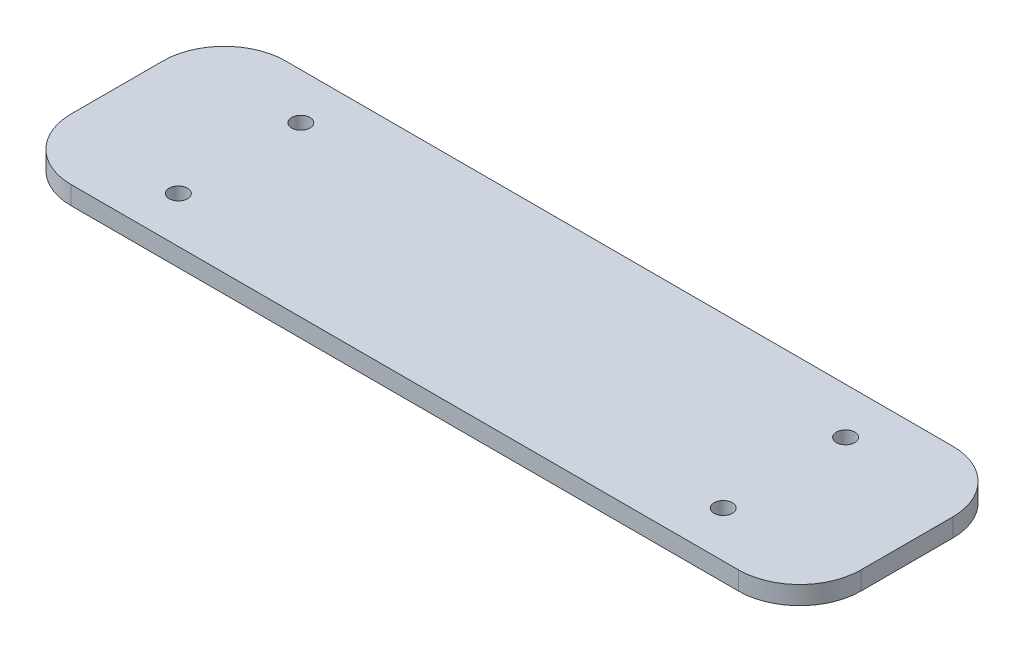
ISO-10303-21;
HEADER;
FILE_DESCRIPTION(('STEP AP214'),'2;1');
FILE_NAME('part.step','',(''),(''),'','','');
FILE_SCHEMA(('AUTOMOTIVE_DESIGN { 1 0 10303 214 1 1 1 1 }'));
ENDSEC;
DATA;
#1=APPLICATION_CONTEXT('core data for automotive mechanical design processes');
#2=APPLICATION_PROTOCOL_DEFINITION('international standard','automotive_design',2000,#1);
#3=PRODUCT_CONTEXT('',#1,'mechanical');
#4=PRODUCT('Part','Part','',(#3));
#5=PRODUCT_RELATED_PRODUCT_CATEGORY('part','',(#4));
#6=PRODUCT_DEFINITION_FORMATION('','',#4);
#7=PRODUCT_DEFINITION_CONTEXT('part definition',#1,'design');
#8=PRODUCT_DEFINITION('design','',#6,#7);
#9=PRODUCT_DEFINITION_SHAPE('','',#8);
#10=(LENGTH_UNIT() NAMED_UNIT(*) SI_UNIT(.MILLI.,.METRE.));
#11=(NAMED_UNIT(*) PLANE_ANGLE_UNIT() SI_UNIT($,.RADIAN.));
#12=(NAMED_UNIT(*) SI_UNIT($,.STERADIAN.) SOLID_ANGLE_UNIT());
#13=UNCERTAINTY_MEASURE_WITH_UNIT(LENGTH_MEASURE(1.E-05),#10,'distance_accuracy_value','');
#14=(GEOMETRIC_REPRESENTATION_CONTEXT(3) GLOBAL_UNCERTAINTY_ASSIGNED_CONTEXT((#13)) GLOBAL_UNIT_ASSIGNED_CONTEXT((#10,
#11,#12)) REPRESENTATION_CONTEXT('',''));
#15=CARTESIAN_POINT('',(0.,0.,0.));
#16=DIRECTION('',(0.,0.,1.));
#17=DIRECTION('',(1.,0.,0.));
#18=AXIS2_PLACEMENT_3D('',#15,#16,#17);
#19=CARTESIAN_POINT('',(0.,3.,0.));
#20=DIRECTION('',(0.,1.,0.));
#21=DIRECTION('',(0.,0.,1.));
#22=AXIS2_PLACEMENT_3D('',#19,#20,#21);
#23=PLANE('',#22);
#24=CARTESIAN_POINT('',(44.5,3.,10.));
#25=DIRECTION('',(0.,1.,0.));
#26=DIRECTION('',(0.,0.,1.));
#27=AXIS2_PLACEMENT_3D('',#24,#25,#26);
#28=CIRCLE('',#27,1.5);
#29=CARTESIAN_POINT('',(44.5,3.,11.5));
#30=VERTEX_POINT('',#29);
#31=EDGE_CURVE('E257',#30,#30,#28,.T.);
#32=ORIENTED_EDGE('',*,*,#31,.F.);
#33=EDGE_LOOP('',(#32));
#34=FACE_BOUND('',#33,.T.);
#35=CARTESIAN_POINT('',(-44.5,3.,-10.));
#36=DIRECTION('',(0.,1.,0.));
#37=DIRECTION('',(0.,0.,1.));
#38=AXIS2_PLACEMENT_3D('',#35,#36,#37);
#39=CIRCLE('',#38,1.5);
#40=CARTESIAN_POINT('',(-44.5,3.,-8.49999999999999));
#41=VERTEX_POINT('',#40);
#42=EDGE_CURVE('E193',#41,#41,#39,.T.);
#43=ORIENTED_EDGE('',*,*,#42,.F.);
#44=EDGE_LOOP('',(#43));
#45=FACE_BOUND('',#44,.T.);
#46=DIRECTION('',(0.,0.,1.));
#47=VECTOR('',#46,1.);
#48=CARTESIAN_POINT('',(-64.5,3.,-17.5));
#49=LINE('',#48,#47);
#50=CARTESIAN_POINT('',(-64.5,3.,-7.5));
#51=VERTEX_POINT('',#50);
#52=CARTESIAN_POINT('',(-64.5,3.,7.5));
#53=VERTEX_POINT('',#52);
#54=EDGE_CURVE('E181',#51,#53,#49,.T.);
#55=ORIENTED_EDGE('',*,*,#54,.T.);
#56=CARTESIAN_POINT('',(-54.5,3.,7.50000000000001));
#57=DIRECTION('',(0.,1.,0.));
#58=DIRECTION('',(0.,0.,1.));
#59=AXIS2_PLACEMENT_3D('',#56,#57,#58);
#60=CIRCLE('',#59,10.);
#61=CARTESIAN_POINT('',(-54.5,3.,17.5));
#62=VERTEX_POINT('',#61);
#63=EDGE_CURVE('E169',#53,#62,#60,.T.);
#64=ORIENTED_EDGE('',*,*,#63,.T.);
#65=DIRECTION('',(1.,0.,0.));
#66=VECTOR('',#65,1.);
#67=CARTESIAN_POINT('',(-64.5,3.,17.5));
#68=LINE('',#67,#66);
#69=CARTESIAN_POINT('',(54.5,3.,17.5));
#70=VERTEX_POINT('',#69);
#71=EDGE_CURVE('E127',#62,#70,#68,.T.);
#72=ORIENTED_EDGE('',*,*,#71,.T.);
#73=CARTESIAN_POINT('',(54.5,3.,7.5));
#74=DIRECTION('',(0.,1.,0.));
#75=DIRECTION('',(0.,0.,1.));
#76=AXIS2_PLACEMENT_3D('',#73,#74,#75);
#77=CIRCLE('',#76,10.);
#78=CARTESIAN_POINT('',(64.5,3.,7.5));
#79=VERTEX_POINT('',#78);
#80=EDGE_CURVE('E166',#70,#79,#77,.T.);
#81=ORIENTED_EDGE('',*,*,#80,.T.);
#82=DIRECTION('',(0.,0.,-1.));
#83=VECTOR('',#82,1.);
#84=CARTESIAN_POINT('',(64.5,3.,-17.5));
#85=LINE('',#84,#83);
#86=CARTESIAN_POINT('',(64.5,3.,-7.5));
#87=VERTEX_POINT('',#86);
#88=EDGE_CURVE('E136',#79,#87,#85,.T.);
#89=ORIENTED_EDGE('',*,*,#88,.T.);
#90=CARTESIAN_POINT('',(54.5,3.,-7.5));
#91=DIRECTION('',(0.,1.,0.));
#92=DIRECTION('',(0.,0.,1.));
#93=AXIS2_PLACEMENT_3D('',#90,#91,#92);
#94=CIRCLE('',#93,10.);
#95=CARTESIAN_POINT('',(54.5,3.,-17.5));
#96=VERTEX_POINT('',#95);
#97=EDGE_CURVE('E61',#87,#96,#94,.T.);
#98=ORIENTED_EDGE('',*,*,#97,.T.);
#99=DIRECTION('',(-1.,0.,0.));
#100=VECTOR('',#99,1.);
#101=CARTESIAN_POINT('',(-64.5,3.,-17.5));
#102=LINE('',#101,#100);
#103=CARTESIAN_POINT('',(-54.5,3.,-17.5));
#104=VERTEX_POINT('',#103);
#105=EDGE_CURVE('E141',#96,#104,#102,.T.);
#106=ORIENTED_EDGE('',*,*,#105,.T.);
#107=CARTESIAN_POINT('',(-54.5,3.,-7.5));
#108=DIRECTION('',(0.,1.,0.));
#109=DIRECTION('',(0.,0.,1.));
#110=AXIS2_PLACEMENT_3D('',#107,#108,#109);
#111=CIRCLE('',#110,10.);
#112=EDGE_CURVE('E161',#104,#51,#111,.T.);
#113=ORIENTED_EDGE('',*,*,#112,.T.);
#114=EDGE_LOOP('',(#55,#64,#72,#81,#89,#98,#106,#113));
#115=FACE_BOUND('',#114,.T.);
#116=CARTESIAN_POINT('',(-44.5,3.,10.));
#117=DIRECTION('',(0.,1.,0.));
#118=DIRECTION('',(0.,0.,1.));
#119=AXIS2_PLACEMENT_3D('',#116,#117,#118);
#120=CIRCLE('',#119,1.5);
#121=CARTESIAN_POINT('',(-44.5,3.,11.5));
#122=VERTEX_POINT('',#121);
#123=EDGE_CURVE('E265',#122,#122,#120,.T.);
#124=ORIENTED_EDGE('',*,*,#123,.F.);
#125=EDGE_LOOP('',(#124));
#126=FACE_BOUND('',#125,.T.);
#127=CARTESIAN_POINT('',(44.5,3.,-10.));
#128=DIRECTION('',(0.,1.,0.));
#129=DIRECTION('',(0.,0.,1.));
#130=AXIS2_PLACEMENT_3D('',#127,#128,#129);
#131=CIRCLE('',#130,1.5);
#132=CARTESIAN_POINT('',(44.5,3.,-8.49999999999999));
#133=VERTEX_POINT('',#132);
#134=EDGE_CURVE('E246',#133,#133,#131,.T.);
#135=ORIENTED_EDGE('',*,*,#134,.F.);
#136=EDGE_LOOP('',(#135));
#137=FACE_BOUND('',#136,.T.);
#138=ADVANCED_FACE('F39',(#34,#45,#115,#126,#137),#23,.T.);
#139=CARTESIAN_POINT('',(0.,0.,0.));
#140=DIRECTION('',(0.,1.,0.));
#141=DIRECTION('',(0.,0.,1.));
#142=AXIS2_PLACEMENT_3D('',#139,#140,#141);
#143=PLANE('',#142);
#144=DIRECTION('',(1.,0.,0.));
#145=VECTOR('',#144,1.);
#146=CARTESIAN_POINT('',(-64.5,0.,17.5));
#147=LINE('',#146,#145);
#148=CARTESIAN_POINT('',(-54.5,0.,17.5));
#149=VERTEX_POINT('',#148);
#150=CARTESIAN_POINT('',(54.5,0.,17.5));
#151=VERTEX_POINT('',#150);
#152=EDGE_CURVE('E124',#149,#151,#147,.T.);
#153=ORIENTED_EDGE('',*,*,#152,.F.);
#154=CARTESIAN_POINT('',(-54.5,0.,7.50000000000001));
#155=DIRECTION('',(0.,1.,0.));
#156=DIRECTION('',(0.,0.,1.));
#157=AXIS2_PLACEMENT_3D('',#154,#155,#156);
#158=CIRCLE('',#157,10.);
#159=CARTESIAN_POINT('',(-64.5,0.,7.5));
#160=VERTEX_POINT('',#159);
#161=EDGE_CURVE('E106',#149,#160,#158,.F.);
#162=ORIENTED_EDGE('',*,*,#161,.T.);
#163=DIRECTION('',(0.,0.,1.));
#164=VECTOR('',#163,1.);
#165=CARTESIAN_POINT('',(-64.5,0.,-17.5));
#166=LINE('',#165,#164);
#167=CARTESIAN_POINT('',(-64.5,0.,-7.5));
#168=VERTEX_POINT('',#167);
#169=EDGE_CURVE('E137',#168,#160,#166,.T.);
#170=ORIENTED_EDGE('',*,*,#169,.F.);
#171=CARTESIAN_POINT('',(-54.5,0.,-7.5));
#172=DIRECTION('',(0.,1.,0.));
#173=DIRECTION('',(0.,0.,1.));
#174=AXIS2_PLACEMENT_3D('',#171,#172,#173);
#175=CIRCLE('',#174,10.);
#176=CARTESIAN_POINT('',(-54.5,0.,-17.5));
#177=VERTEX_POINT('',#176);
#178=EDGE_CURVE('E129',#168,#177,#175,.F.);
#179=ORIENTED_EDGE('',*,*,#178,.T.);
#180=DIRECTION('',(-1.,0.,0.));
#181=VECTOR('',#180,1.);
#182=CARTESIAN_POINT('',(-64.5,0.,-17.5));
#183=LINE('',#182,#181);
#184=CARTESIAN_POINT('',(54.5,0.,-17.5));
#185=VERTEX_POINT('',#184);
#186=EDGE_CURVE('E143',#185,#177,#183,.T.);
#187=ORIENTED_EDGE('',*,*,#186,.F.);
#188=CARTESIAN_POINT('',(54.5,0.,-7.5));
#189=DIRECTION('',(0.,1.,0.));
#190=DIRECTION('',(0.,0.,1.));
#191=AXIS2_PLACEMENT_3D('',#188,#189,#190);
#192=CIRCLE('',#191,10.);
#193=CARTESIAN_POINT('',(64.5,0.,-7.5));
#194=VERTEX_POINT('',#193);
#195=EDGE_CURVE('E151',#185,#194,#192,.F.);
#196=ORIENTED_EDGE('',*,*,#195,.T.);
#197=DIRECTION('',(0.,0.,-1.));
#198=VECTOR('',#197,1.);
#199=CARTESIAN_POINT('',(64.5,0.,-17.5));
#200=LINE('',#199,#198);
#201=CARTESIAN_POINT('',(64.5,0.,7.5));
#202=VERTEX_POINT('',#201);
#203=EDGE_CURVE('E190',#202,#194,#200,.T.);
#204=ORIENTED_EDGE('',*,*,#203,.F.);
#205=CARTESIAN_POINT('',(54.5,0.,7.5));
#206=DIRECTION('',(0.,1.,0.));
#207=DIRECTION('',(0.,0.,1.));
#208=AXIS2_PLACEMENT_3D('',#205,#206,#207);
#209=CIRCLE('',#208,10.);
#210=EDGE_CURVE('E118',#202,#151,#209,.F.);
#211=ORIENTED_EDGE('',*,*,#210,.T.);
#212=EDGE_LOOP('',(#153,#162,#170,#179,#187,#196,#204,#211));
#213=FACE_BOUND('',#212,.T.);
#214=CARTESIAN_POINT('',(-44.5,0.,-10.));
#215=DIRECTION('',(0.,1.,0.));
#216=DIRECTION('',(0.,0.,1.));
#217=AXIS2_PLACEMENT_3D('',#214,#215,#216);
#218=CIRCLE('',#217,1.5);
#219=CARTESIAN_POINT('',(-44.5,0.,-8.49999999999999));
#220=VERTEX_POINT('',#219);
#221=EDGE_CURVE('E269',#220,#220,#218,.T.);
#222=ORIENTED_EDGE('',*,*,#221,.T.);
#223=EDGE_LOOP('',(#222));
#224=FACE_BOUND('',#223,.T.);
#225=CARTESIAN_POINT('',(-44.5,0.,10.));
#226=DIRECTION('',(0.,1.,0.));
#227=DIRECTION('',(0.,0.,1.));
#228=AXIS2_PLACEMENT_3D('',#225,#226,#227);
#229=CIRCLE('',#228,1.5);
#230=CARTESIAN_POINT('',(-44.5,0.,11.5));
#231=VERTEX_POINT('',#230);
#232=EDGE_CURVE('E261',#231,#231,#229,.T.);
#233=ORIENTED_EDGE('',*,*,#232,.T.);
#234=EDGE_LOOP('',(#233));
#235=FACE_BOUND('',#234,.T.);
#236=CARTESIAN_POINT('',(44.5,0.,10.));
#237=DIRECTION('',(0.,1.,0.));
#238=DIRECTION('',(0.,0.,1.));
#239=AXIS2_PLACEMENT_3D('',#236,#237,#238);
#240=CIRCLE('',#239,1.5);
#241=CARTESIAN_POINT('',(44.5,0.,11.5));
#242=VERTEX_POINT('',#241);
#243=EDGE_CURVE('E254',#242,#242,#240,.T.);
#244=ORIENTED_EDGE('',*,*,#243,.T.);
#245=EDGE_LOOP('',(#244));
#246=FACE_BOUND('',#245,.T.);
#247=CARTESIAN_POINT('',(44.5,0.,-10.));
#248=DIRECTION('',(0.,1.,0.));
#249=DIRECTION('',(0.,0.,1.));
#250=AXIS2_PLACEMENT_3D('',#247,#248,#249);
#251=CIRCLE('',#250,1.5);
#252=CARTESIAN_POINT('',(44.5,0.,-8.49999999999999));
#253=VERTEX_POINT('',#252);
#254=EDGE_CURVE('E249',#253,#253,#251,.T.);
#255=ORIENTED_EDGE('',*,*,#254,.T.);
#256=EDGE_LOOP('',(#255));
#257=FACE_BOUND('',#256,.T.);
#258=ADVANCED_FACE('F132',(#213,#224,#235,#246,#257),#143,.F.);
#259=CARTESIAN_POINT('',(64.5,3.,-17.5));
#260=DIRECTION('',(-1.,0.,0.));
#261=DIRECTION('',(0.,0.,1.));
#262=AXIS2_PLACEMENT_3D('',#259,#260,#261);
#263=PLANE('',#262);
#264=ORIENTED_EDGE('',*,*,#88,.F.);
#265=DIRECTION('',(0.,-1.,0.));
#266=VECTOR('',#265,1.);
#267=CARTESIAN_POINT('',(64.5,3.,7.5));
#268=LINE('',#267,#266);
#269=EDGE_CURVE('E175',#79,#202,#268,.T.);
#270=ORIENTED_EDGE('',*,*,#269,.T.);
#271=ORIENTED_EDGE('',*,*,#203,.T.);
#272=DIRECTION('',(0.,-1.,0.));
#273=VECTOR('',#272,1.);
#274=CARTESIAN_POINT('',(64.5,3.,-7.5));
#275=LINE('',#274,#273);
#276=EDGE_CURVE('E172',#194,#87,#275,.F.);
#277=ORIENTED_EDGE('',*,*,#276,.T.);
#278=EDGE_LOOP('',(#264,#270,#271,#277));
#279=FACE_BOUND('',#278,.T.);
#280=ADVANCED_FACE('F212',(#279),#263,.F.);
#281=CARTESIAN_POINT('',(-64.5,3.,-17.5));
#282=DIRECTION('',(0.,0.,1.));
#283=DIRECTION('',(1.,0.,0.));
#284=AXIS2_PLACEMENT_3D('',#281,#282,#283);
#285=PLANE('',#284);
#286=ORIENTED_EDGE('',*,*,#105,.F.);
#287=DIRECTION('',(0.,-1.,0.));
#288=VECTOR('',#287,1.);
#289=CARTESIAN_POINT('',(54.5,3.,-17.5));
#290=LINE('',#289,#288);
#291=EDGE_CURVE('E11',#96,#185,#290,.T.);
#292=ORIENTED_EDGE('',*,*,#291,.T.);
#293=ORIENTED_EDGE('',*,*,#186,.T.);
#294=DIRECTION('',(0.,-1.,0.));
#295=VECTOR('',#294,1.);
#296=CARTESIAN_POINT('',(-54.5,3.,-17.5));
#297=LINE('',#296,#295);
#298=EDGE_CURVE('E48',#177,#104,#297,.F.);
#299=ORIENTED_EDGE('',*,*,#298,.T.);
#300=EDGE_LOOP('',(#286,#292,#293,#299));
#301=FACE_BOUND('',#300,.T.);
#302=ADVANCED_FACE('F196',(#301),#285,.F.);
#303=CARTESIAN_POINT('',(-64.5,3.,-17.5));
#304=DIRECTION('',(1.,0.,0.));
#305=DIRECTION('',(0.,0.,-1.));
#306=AXIS2_PLACEMENT_3D('',#303,#304,#305);
#307=PLANE('',#306);
#308=ORIENTED_EDGE('',*,*,#169,.T.);
#309=DIRECTION('',(0.,-1.,0.));
#310=VECTOR('',#309,1.);
#311=CARTESIAN_POINT('',(-64.5,3.,7.5));
#312=LINE('',#311,#310);
#313=EDGE_CURVE('E111',#160,#53,#312,.F.);
#314=ORIENTED_EDGE('',*,*,#313,.T.);
#315=ORIENTED_EDGE('',*,*,#54,.F.);
#316=DIRECTION('',(0.,-1.,0.));
#317=VECTOR('',#316,1.);
#318=CARTESIAN_POINT('',(-64.5,3.,-7.5));
#319=LINE('',#318,#317);
#320=EDGE_CURVE('E117',#51,#168,#319,.T.);
#321=ORIENTED_EDGE('',*,*,#320,.T.);
#322=EDGE_LOOP('',(#308,#314,#315,#321));
#323=FACE_BOUND('',#322,.T.);
#324=ADVANCED_FACE('F203',(#323),#307,.F.);
#325=CARTESIAN_POINT('',(-64.5,3.,17.5));
#326=DIRECTION('',(0.,0.,-1.));
#327=DIRECTION('',(-1.,0.,0.));
#328=AXIS2_PLACEMENT_3D('',#325,#326,#327);
#329=PLANE('',#328);
#330=ORIENTED_EDGE('',*,*,#71,.F.);
#331=DIRECTION('',(0.,-1.,0.));
#332=VECTOR('',#331,1.);
#333=CARTESIAN_POINT('',(-54.5,3.,17.5));
#334=LINE('',#333,#332);
#335=EDGE_CURVE('E110',#62,#149,#334,.T.);
#336=ORIENTED_EDGE('',*,*,#335,.T.);
#337=ORIENTED_EDGE('',*,*,#152,.T.);
#338=DIRECTION('',(0.,-1.,0.));
#339=VECTOR('',#338,1.);
#340=CARTESIAN_POINT('',(54.5,3.,17.5));
#341=LINE('',#340,#339);
#342=EDGE_CURVE('E130',#151,#70,#341,.F.);
#343=ORIENTED_EDGE('',*,*,#342,.T.);
#344=EDGE_LOOP('',(#330,#336,#337,#343));
#345=FACE_BOUND('',#344,.T.);
#346=ADVANCED_FACE('F123',(#345),#329,.F.);
#347=CARTESIAN_POINT('',(-44.5,3.,-10.));
#348=DIRECTION('',(0.,-1.,0.));
#349=DIRECTION('',(0.,0.,-1.));
#350=AXIS2_PLACEMENT_3D('',#347,#348,#349);
#351=CYLINDRICAL_SURFACE('',#350,1.5);
#352=ORIENTED_EDGE('',*,*,#42,.T.);
#353=EDGE_LOOP('',(#352));
#354=FACE_BOUND('',#353,.T.);
#355=ORIENTED_EDGE('',*,*,#221,.F.);
#356=EDGE_LOOP('',(#355));
#357=FACE_BOUND('',#356,.T.);
#358=ADVANCED_FACE('F210',(#354,#357),#351,.F.);
#359=CARTESIAN_POINT('',(-44.5,3.,10.));
#360=DIRECTION('',(0.,-1.,0.));
#361=DIRECTION('',(0.,0.,-1.));
#362=AXIS2_PLACEMENT_3D('',#359,#360,#361);
#363=CYLINDRICAL_SURFACE('',#362,1.5);
#364=ORIENTED_EDGE('',*,*,#123,.T.);
#365=EDGE_LOOP('',(#364));
#366=FACE_BOUND('',#365,.T.);
#367=ORIENTED_EDGE('',*,*,#232,.F.);
#368=EDGE_LOOP('',(#367));
#369=FACE_BOUND('',#368,.T.);
#370=ADVANCED_FACE('F226',(#366,#369),#363,.F.);
#371=CARTESIAN_POINT('',(44.5,3.,10.));
#372=DIRECTION('',(0.,-1.,0.));
#373=DIRECTION('',(0.,0.,-1.));
#374=AXIS2_PLACEMENT_3D('',#371,#372,#373);
#375=CYLINDRICAL_SURFACE('',#374,1.5);
#376=ORIENTED_EDGE('',*,*,#31,.T.);
#377=EDGE_LOOP('',(#376));
#378=FACE_BOUND('',#377,.T.);
#379=ORIENTED_EDGE('',*,*,#243,.F.);
#380=EDGE_LOOP('',(#379));
#381=FACE_BOUND('',#380,.T.);
#382=ADVANCED_FACE('F230',(#378,#381),#375,.F.);
#383=CARTESIAN_POINT('',(44.5,3.,-10.));
#384=DIRECTION('',(0.,-1.,0.));
#385=DIRECTION('',(0.,0.,-1.));
#386=AXIS2_PLACEMENT_3D('',#383,#384,#385);
#387=CYLINDRICAL_SURFACE('',#386,1.5);
#388=ORIENTED_EDGE('',*,*,#134,.T.);
#389=EDGE_LOOP('',(#388));
#390=FACE_BOUND('',#389,.T.);
#391=ORIENTED_EDGE('',*,*,#254,.F.);
#392=EDGE_LOOP('',(#391));
#393=FACE_BOUND('',#392,.T.);
#394=ADVANCED_FACE('F234',(#390,#393),#387,.F.);
#395=CARTESIAN_POINT('',(-54.5,3.,7.50000000000001));
#396=DIRECTION('',(0.,-1.,0.));
#397=DIRECTION('',(0.,0.,-1.));
#398=AXIS2_PLACEMENT_3D('',#395,#396,#397);
#399=CYLINDRICAL_SURFACE('',#398,10.);
#400=ORIENTED_EDGE('',*,*,#63,.F.);
#401=ORIENTED_EDGE('',*,*,#313,.F.);
#402=ORIENTED_EDGE('',*,*,#161,.F.);
#403=ORIENTED_EDGE('',*,*,#335,.F.);
#404=EDGE_LOOP('',(#400,#401,#402,#403));
#405=FACE_BOUND('',#404,.T.);
#406=ADVANCED_FACE('F109',(#405),#399,.T.);
#407=CARTESIAN_POINT('',(54.5,3.,7.5));
#408=DIRECTION('',(0.,-1.,0.));
#409=DIRECTION('',(0.,0.,-1.));
#410=AXIS2_PLACEMENT_3D('',#407,#408,#409);
#411=CYLINDRICAL_SURFACE('',#410,10.);
#412=ORIENTED_EDGE('',*,*,#80,.F.);
#413=ORIENTED_EDGE('',*,*,#342,.F.);
#414=ORIENTED_EDGE('',*,*,#210,.F.);
#415=ORIENTED_EDGE('',*,*,#269,.F.);
#416=EDGE_LOOP('',(#412,#413,#414,#415));
#417=FACE_BOUND('',#416,.T.);
#418=ADVANCED_FACE('F241',(#417),#411,.T.);
#419=CARTESIAN_POINT('',(54.5,3.,-7.5));
#420=DIRECTION('',(0.,-1.,0.));
#421=DIRECTION('',(0.,0.,-1.));
#422=AXIS2_PLACEMENT_3D('',#419,#420,#421);
#423=CYLINDRICAL_SURFACE('',#422,10.);
#424=ORIENTED_EDGE('',*,*,#97,.F.);
#425=ORIENTED_EDGE('',*,*,#276,.F.);
#426=ORIENTED_EDGE('',*,*,#195,.F.);
#427=ORIENTED_EDGE('',*,*,#291,.F.);
#428=EDGE_LOOP('',(#424,#425,#426,#427));
#429=FACE_BOUND('',#428,.T.);
#430=ADVANCED_FACE('F291',(#429),#423,.T.);
#431=CARTESIAN_POINT('',(-54.5,3.,-7.5));
#432=DIRECTION('',(0.,-1.,0.));
#433=DIRECTION('',(0.,0.,-1.));
#434=AXIS2_PLACEMENT_3D('',#431,#432,#433);
#435=CYLINDRICAL_SURFACE('',#434,10.);
#436=ORIENTED_EDGE('',*,*,#112,.F.);
#437=ORIENTED_EDGE('',*,*,#298,.F.);
#438=ORIENTED_EDGE('',*,*,#178,.F.);
#439=ORIENTED_EDGE('',*,*,#320,.F.);
#440=EDGE_LOOP('',(#436,#437,#438,#439));
#441=FACE_BOUND('',#440,.T.);
#442=ADVANCED_FACE('F41',(#441),#435,.T.);
#443=CLOSED_SHELL('',(#138,#258,#280,#302,#324,#346,#358,#370,#382,#394,#406,#418,#430,#442));
#444=MANIFOLD_SOLID_BREP('B2',#443);
#445=ADVANCED_BREP_SHAPE_REPRESENTATION('',(#18,#444),#14);
#446=SHAPE_DEFINITION_REPRESENTATION(#9,#445);
ENDSEC;
END-ISO-10303-21;
